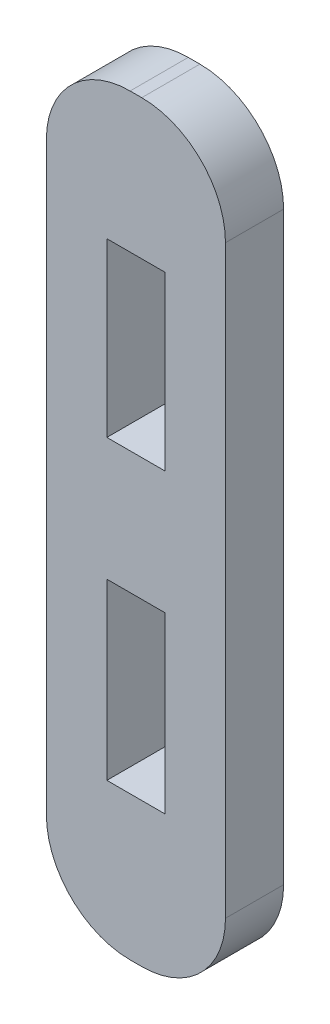
ISO-10303-21;
HEADER;
FILE_DESCRIPTION(('STEP AP214'),'2;1');
FILE_NAME('part.step','',(''),(''),'','','');
FILE_SCHEMA(('AUTOMOTIVE_DESIGN { 1 0 10303 214 1 1 1 1 }'));
ENDSEC;
DATA;
#1=APPLICATION_CONTEXT('core data for automotive mechanical design processes');
#2=APPLICATION_PROTOCOL_DEFINITION('international standard','automotive_design',2000,#1);
#3=PRODUCT_CONTEXT('',#1,'mechanical');
#4=PRODUCT('Part','Part','',(#3));
#5=PRODUCT_RELATED_PRODUCT_CATEGORY('part','',(#4));
#6=PRODUCT_DEFINITION_FORMATION('','',#4);
#7=PRODUCT_DEFINITION_CONTEXT('part definition',#1,'design');
#8=PRODUCT_DEFINITION('design','',#6,#7);
#9=PRODUCT_DEFINITION_SHAPE('','',#8);
#10=(LENGTH_UNIT() NAMED_UNIT(*) SI_UNIT(.MILLI.,.METRE.));
#11=(NAMED_UNIT(*) PLANE_ANGLE_UNIT() SI_UNIT($,.RADIAN.));
#12=(NAMED_UNIT(*) SI_UNIT($,.STERADIAN.) SOLID_ANGLE_UNIT());
#13=UNCERTAINTY_MEASURE_WITH_UNIT(LENGTH_MEASURE(1.E-05),#10,'distance_accuracy_value','');
#14=(GEOMETRIC_REPRESENTATION_CONTEXT(3) GLOBAL_UNCERTAINTY_ASSIGNED_CONTEXT((#13)) GLOBAL_UNIT_ASSIGNED_CONTEXT((#10,
#11,#12)) REPRESENTATION_CONTEXT('',''));
#15=CARTESIAN_POINT('',(0.,0.,0.));
#16=DIRECTION('',(0.,0.,1.));
#17=DIRECTION('',(1.,0.,0.));
#18=AXIS2_PLACEMENT_3D('',#15,#16,#17);
#19=CARTESIAN_POINT('',(0.,0.,1.5875));
#20=DIRECTION('',(1.,0.,0.));
#21=DIRECTION('',(0.,0.,-1.));
#22=AXIS2_PLACEMENT_3D('',#19,#20,#21);
#23=PLANE('',#22);
#24=DIRECTION('',(0.,-1.,0.));
#25=VECTOR('',#24,1.);
#26=CARTESIAN_POINT('',(0.,0.,0.));
#27=LINE('',#26,#25);
#28=CARTESIAN_POINT('',(0.,18.2591767851915,0.));
#29=VERTEX_POINT('',#28);
#30=CARTESIAN_POINT('',(0.,2.286,0.));
#31=VERTEX_POINT('',#30);
#32=EDGE_CURVE('E217',#29,#31,#27,.T.);
#33=ORIENTED_EDGE('',*,*,#32,.T.);
#34=DIRECTION('',(0.,0.,-1.));
#35=VECTOR('',#34,1.);
#36=CARTESIAN_POINT('',(0.,2.286,1.5875));
#37=LINE('',#36,#35);
#38=CARTESIAN_POINT('',(0.,2.286,1.5875));
#39=VERTEX_POINT('',#38);
#40=EDGE_CURVE('E259',#31,#39,#37,.F.);
#41=ORIENTED_EDGE('',*,*,#40,.T.);
#42=DIRECTION('',(0.,-1.,0.));
#43=VECTOR('',#42,1.);
#44=CARTESIAN_POINT('',(0.,0.,1.5875));
#45=LINE('',#44,#43);
#46=CARTESIAN_POINT('',(0.,18.2591767851915,1.5875));
#47=VERTEX_POINT('',#46);
#48=EDGE_CURVE('E223',#47,#39,#45,.T.);
#49=ORIENTED_EDGE('',*,*,#48,.F.);
#50=DIRECTION('',(0.,0.,-1.));
#51=VECTOR('',#50,1.);
#52=CARTESIAN_POINT('',(0.,18.2591767851915,1.5875));
#53=LINE('',#52,#51);
#54=EDGE_CURVE('E256',#47,#29,#53,.T.);
#55=ORIENTED_EDGE('',*,*,#54,.T.);
#56=EDGE_LOOP('',(#33,#41,#49,#55));
#57=FACE_BOUND('',#56,.T.);
#58=ADVANCED_FACE('F33',(#57),#23,.F.);
#59=CARTESIAN_POINT('',(0.,0.,1.5875));
#60=DIRECTION('',(0.,1.,0.));
#61=DIRECTION('',(0.,0.,1.));
#62=AXIS2_PLACEMENT_3D('',#59,#60,#61);
#63=PLANE('',#62);
#64=DIRECTION('',(1.,0.,0.));
#65=VECTOR('',#64,1.);
#66=CARTESIAN_POINT('',(0.,0.,1.5875));
#67=LINE('',#66,#65);
#68=CARTESIAN_POINT('',(2.286,0.,1.5875));
#69=VERTEX_POINT('',#68);
#70=CARTESIAN_POINT('',(2.60350000000089,0.,1.5875));
#71=VERTEX_POINT('',#70);
#72=EDGE_CURVE('E226',#69,#71,#67,.T.);
#73=ORIENTED_EDGE('',*,*,#72,.F.);
#74=DIRECTION('',(0.,0.,-1.));
#75=VECTOR('',#74,1.);
#76=CARTESIAN_POINT('',(2.286,0.,1.5875));
#77=LINE('',#76,#75);
#78=CARTESIAN_POINT('',(2.286,0.,0.));
#79=VERTEX_POINT('',#78);
#80=EDGE_CURVE('E245',#69,#79,#77,.T.);
#81=ORIENTED_EDGE('',*,*,#80,.T.);
#82=DIRECTION('',(1.,0.,0.));
#83=VECTOR('',#82,1.);
#84=CARTESIAN_POINT('',(0.,0.,0.));
#85=LINE('',#84,#83);
#86=CARTESIAN_POINT('',(2.60350000000089,0.,0.));
#87=VERTEX_POINT('',#86);
#88=EDGE_CURVE('E237',#79,#87,#85,.T.);
#89=ORIENTED_EDGE('',*,*,#88,.T.);
#90=DIRECTION('',(0.,0.,-1.));
#91=VECTOR('',#90,1.);
#92=CARTESIAN_POINT('',(2.60350000000089,0.,1.5875));
#93=LINE('',#92,#91);
#94=EDGE_CURVE('E234',#87,#71,#93,.F.);
#95=ORIENTED_EDGE('',*,*,#94,.T.);
#96=EDGE_LOOP('',(#73,#81,#89,#95));
#97=FACE_BOUND('',#96,.T.);
#98=ADVANCED_FACE('F301',(#97),#63,.F.);
#99=CARTESIAN_POINT('',(4.88950000000089,0.,1.5875));
#100=DIRECTION('',(-1.,0.,0.));
#101=DIRECTION('',(0.,-1.,0.));
#102=AXIS2_PLACEMENT_3D('',#99,#100,#101);
#103=PLANE('',#102);
#104=DIRECTION('',(0.,1.,0.));
#105=VECTOR('',#104,1.);
#106=CARTESIAN_POINT('',(4.88950000000089,0.,1.5875));
#107=LINE('',#106,#105);
#108=CARTESIAN_POINT('',(4.88950000000089,2.286,1.5875));
#109=VERTEX_POINT('',#108);
#110=CARTESIAN_POINT('',(4.88950000000092,18.2591767851915,1.5875));
#111=VERTEX_POINT('',#110);
#112=EDGE_CURVE('E230',#109,#111,#107,.T.);
#113=ORIENTED_EDGE('',*,*,#112,.F.);
#114=DIRECTION('',(0.,0.,-1.));
#115=VECTOR('',#114,1.);
#116=CARTESIAN_POINT('',(4.88950000000089,2.286,1.5875));
#117=LINE('',#116,#115);
#118=CARTESIAN_POINT('',(4.88950000000089,2.286,0.));
#119=VERTEX_POINT('',#118);
#120=EDGE_CURVE('E270',#109,#119,#117,.T.);
#121=ORIENTED_EDGE('',*,*,#120,.T.);
#122=DIRECTION('',(0.,1.,0.));
#123=VECTOR('',#122,1.);
#124=CARTESIAN_POINT('',(4.88950000000089,0.,0.));
#125=LINE('',#124,#123);
#126=CARTESIAN_POINT('',(4.88950000000092,18.2591767851915,0.));
#127=VERTEX_POINT('',#126);
#128=EDGE_CURVE('E240',#119,#127,#125,.T.);
#129=ORIENTED_EDGE('',*,*,#128,.T.);
#130=DIRECTION('',(0.,0.,-1.));
#131=VECTOR('',#130,1.);
#132=CARTESIAN_POINT('',(4.88950000000092,18.2591767851915,1.5875));
#133=LINE('',#132,#131);
#134=EDGE_CURVE('E268',#127,#111,#133,.F.);
#135=ORIENTED_EDGE('',*,*,#134,.T.);
#136=EDGE_LOOP('',(#113,#121,#129,#135));
#137=FACE_BOUND('',#136,.T.);
#138=ADVANCED_FACE('F276',(#137),#103,.F.);
#139=CARTESIAN_POINT('',(0.,20.5451767851915,1.5875));
#140=DIRECTION('',(0.,-1.,0.));
#141=DIRECTION('',(0.,0.,-1.));
#142=AXIS2_PLACEMENT_3D('',#139,#140,#141);
#143=PLANE('',#142);
#144=DIRECTION('',(-1.,0.,0.));
#145=VECTOR('',#144,1.);
#146=CARTESIAN_POINT('',(0.,20.5451767851915,1.5875));
#147=LINE('',#146,#145);
#148=CARTESIAN_POINT('',(2.60350000000092,20.5451767851915,1.5875));
#149=VERTEX_POINT('',#148);
#150=CARTESIAN_POINT('',(2.286,20.5451767851915,1.5875));
#151=VERTEX_POINT('',#150);
#152=EDGE_CURVE('E232',#149,#151,#147,.T.);
#153=ORIENTED_EDGE('',*,*,#152,.F.);
#154=DIRECTION('',(0.,0.,-1.));
#155=VECTOR('',#154,1.);
#156=CARTESIAN_POINT('',(2.60350000000092,20.5451767851915,1.5875));
#157=LINE('',#156,#155);
#158=CARTESIAN_POINT('',(2.60350000000092,20.5451767851915,0.));
#159=VERTEX_POINT('',#158);
#160=EDGE_CURVE('E11',#149,#159,#157,.T.);
#161=ORIENTED_EDGE('',*,*,#160,.T.);
#162=DIRECTION('',(-1.,0.,0.));
#163=VECTOR('',#162,1.);
#164=CARTESIAN_POINT('',(0.,20.5451767851915,0.));
#165=LINE('',#164,#163);
#166=CARTESIAN_POINT('',(2.286,20.5451767851915,0.));
#167=VERTEX_POINT('',#166);
#168=EDGE_CURVE('E227',#159,#167,#165,.T.);
#169=ORIENTED_EDGE('',*,*,#168,.T.);
#170=DIRECTION('',(0.,0.,-1.));
#171=VECTOR('',#170,1.);
#172=CARTESIAN_POINT('',(2.286,20.5451767851915,1.5875));
#173=LINE('',#172,#171);
#174=EDGE_CURVE('E41',#167,#151,#173,.F.);
#175=ORIENTED_EDGE('',*,*,#174,.T.);
#176=EDGE_LOOP('',(#153,#161,#169,#175));
#177=FACE_BOUND('',#176,.T.);
#178=ADVANCED_FACE('F287',(#177),#143,.F.);
#179=CARTESIAN_POINT('',(0.,0.,1.5875));
#180=DIRECTION('',(0.,0.,-1.));
#181=DIRECTION('',(-1.,0.,0.));
#182=AXIS2_PLACEMENT_3D('',#179,#180,#181);
#183=PLANE('',#182);
#184=DIRECTION('',(-1.,0.,0.));
#185=VECTOR('',#184,1.);
#186=CARTESIAN_POINT('',(3.23850000000115,12.0361767851871,1.5875));
#187=LINE('',#186,#185);
#188=CARTESIAN_POINT('',(3.23850000000115,12.0361767851871,1.5875));
#189=VERTEX_POINT('',#188);
#190=CARTESIAN_POINT('',(1.65100000000115,12.0361767851871,1.5875));
#191=VERTEX_POINT('',#190);
#192=EDGE_CURVE('E158',#189,#191,#187,.T.);
#193=ORIENTED_EDGE('',*,*,#192,.T.);
#194=DIRECTION('',(0.,1.,0.));
#195=VECTOR('',#194,1.);
#196=CARTESIAN_POINT('',(1.65100000000105,15.3513619189804,1.5875));
#197=LINE('',#196,#195);
#198=CARTESIAN_POINT('',(1.65100000000093,16.7351767851914,1.5875));
#199=VERTEX_POINT('',#198);
#200=EDGE_CURVE('E150',#191,#199,#197,.T.);
#201=ORIENTED_EDGE('',*,*,#200,.T.);
#202=DIRECTION('',(1.,0.,0.));
#203=VECTOR('',#202,1.);
#204=CARTESIAN_POINT('',(3.23850000000093,16.7351767851915,1.5875));
#205=LINE('',#204,#203);
#206=CARTESIAN_POINT('',(3.23850000000093,16.7351767851915,1.5875));
#207=VERTEX_POINT('',#206);
#208=EDGE_CURVE('E162',#199,#207,#205,.T.);
#209=ORIENTED_EDGE('',*,*,#208,.T.);
#210=DIRECTION('',(1.19447510828985E-13,-1.,0.));
#211=VECTOR('',#210,1.);
#212=CARTESIAN_POINT('',(3.23850000000105,15.6786362846699,1.5875));
#213=LINE('',#212,#211);
#214=EDGE_CURVE('E166',#207,#189,#213,.T.);
#215=ORIENTED_EDGE('',*,*,#214,.T.);
#216=EDGE_LOOP('',(#193,#201,#209,#215));
#217=FACE_BOUND('',#216,.T.);
#218=DIRECTION('',(-1.,0.,0.));
#219=VECTOR('',#218,1.);
#220=CARTESIAN_POINT('',(3.23850000000205,3.92778961237441,1.5875));
#221=LINE('',#220,#219);
#222=CARTESIAN_POINT('',(3.23850000000205,3.92778961237441,1.5875));
#223=VERTEX_POINT('',#222);
#224=CARTESIAN_POINT('',(1.65100000000205,3.92778961237427,1.5875));
#225=VERTEX_POINT('',#224);
#226=EDGE_CURVE('E201',#223,#225,#221,.T.);
#227=ORIENTED_EDGE('',*,*,#226,.T.);
#228=DIRECTION('',(0.,1.,0.));
#229=VECTOR('',#228,1.);
#230=CARTESIAN_POINT('',(1.65100000000196,4.86656469932414,1.5875));
#231=LINE('',#230,#229);
#232=CARTESIAN_POINT('',(1.65100000000115,8.68424253618715,1.5875));
#233=VERTEX_POINT('',#232);
#234=EDGE_CURVE('E191',#225,#233,#231,.T.);
#235=ORIENTED_EDGE('',*,*,#234,.T.);
#236=DIRECTION('',(1.,0.,0.));
#237=VECTOR('',#236,1.);
#238=CARTESIAN_POINT('',(3.23850000000115,8.68424253618715,1.5875));
#239=LINE('',#238,#237);
#240=CARTESIAN_POINT('',(3.23850000000115,8.68424253618715,1.5875));
#241=VERTEX_POINT('',#240);
#242=EDGE_CURVE('E194',#233,#241,#239,.T.);
#243=ORIENTED_EDGE('',*,*,#242,.T.);
#244=DIRECTION('',(2.99817312634776E-13,-1.,0.));
#245=VECTOR('',#244,1.);
#246=CARTESIAN_POINT('',(3.23850000000183,6.40747712261544,1.5875));
#247=LINE('',#246,#245);
#248=EDGE_CURVE('E198',#241,#223,#247,.T.);
#249=ORIENTED_EDGE('',*,*,#248,.T.);
#250=EDGE_LOOP('',(#227,#235,#243,#249));
#251=FACE_BOUND('',#250,.T.);
#252=ORIENTED_EDGE('',*,*,#48,.T.);
#253=CARTESIAN_POINT('',(2.286,2.286,1.5875));
#254=DIRECTION('',(0.,0.,-1.));
#255=DIRECTION('',(-1.,0.,0.));
#256=AXIS2_PLACEMENT_3D('',#253,#254,#255);
#257=CIRCLE('',#256,2.286);
#258=EDGE_CURVE('E266',#39,#69,#257,.F.);
#259=ORIENTED_EDGE('',*,*,#258,.T.);
#260=ORIENTED_EDGE('',*,*,#72,.T.);
#261=CARTESIAN_POINT('',(2.60350000000089,2.286,1.5875));
#262=DIRECTION('',(0.,0.,-1.));
#263=DIRECTION('',(-1.,0.,0.));
#264=AXIS2_PLACEMENT_3D('',#261,#262,#263);
#265=CIRCLE('',#264,2.286);
#266=EDGE_CURVE('E264',#71,#109,#265,.F.);
#267=ORIENTED_EDGE('',*,*,#266,.T.);
#268=ORIENTED_EDGE('',*,*,#112,.T.);
#269=CARTESIAN_POINT('',(2.60350000000092,18.2591767851915,1.5875));
#270=DIRECTION('',(0.,0.,-1.));
#271=DIRECTION('',(-1.,0.,0.));
#272=AXIS2_PLACEMENT_3D('',#269,#270,#271);
#273=CIRCLE('',#272,2.286);
#274=EDGE_CURVE('E54',#111,#149,#273,.F.);
#275=ORIENTED_EDGE('',*,*,#274,.T.);
#276=ORIENTED_EDGE('',*,*,#152,.T.);
#277=CARTESIAN_POINT('',(2.286,18.2591767851915,1.5875));
#278=DIRECTION('',(0.,0.,-1.));
#279=DIRECTION('',(-1.,0.,0.));
#280=AXIS2_PLACEMENT_3D('',#277,#278,#279);
#281=CIRCLE('',#280,2.286);
#282=EDGE_CURVE('E261',#151,#47,#281,.F.);
#283=ORIENTED_EDGE('',*,*,#282,.T.);
#284=EDGE_LOOP('',(#252,#259,#260,#267,#268,#275,#276,#283));
#285=FACE_BOUND('',#284,.T.);
#286=ADVANCED_FACE('F169',(#217,#251,#285),#183,.F.);
#287=CARTESIAN_POINT('',(0.,0.,0.));
#288=DIRECTION('',(0.,0.,-1.));
#289=DIRECTION('',(-1.,0.,0.));
#290=AXIS2_PLACEMENT_3D('',#287,#288,#289);
#291=PLANE('',#290);
#292=DIRECTION('',(0.,1.,0.));
#293=VECTOR('',#292,1.);
#294=CARTESIAN_POINT('',(1.65100000000115,14.195176785187,0.));
#295=LINE('',#294,#293);
#296=CARTESIAN_POINT('',(1.65100000000115,12.0361767851871,0.));
#297=VERTEX_POINT('',#296);
#298=CARTESIAN_POINT('',(1.65100000000093,16.7351767851914,0.));
#299=VERTEX_POINT('',#298);
#300=EDGE_CURVE('E153',#297,#299,#295,.T.);
#301=ORIENTED_EDGE('',*,*,#300,.F.);
#302=DIRECTION('',(-1.,0.,0.));
#303=VECTOR('',#302,1.);
#304=CARTESIAN_POINT('',(3.23850000000115,12.0361767851871,0.));
#305=LINE('',#304,#303);
#306=CARTESIAN_POINT('',(3.23850000000115,12.0361767851871,0.));
#307=VERTEX_POINT('',#306);
#308=EDGE_CURVE('E173',#307,#297,#305,.T.);
#309=ORIENTED_EDGE('',*,*,#308,.F.);
#310=DIRECTION('',(0.,-1.,0.));
#311=VECTOR('',#310,1.);
#312=CARTESIAN_POINT('',(3.23850000000115,14.1951767851871,0.));
#313=LINE('',#312,#311);
#314=CARTESIAN_POINT('',(3.23850000000093,16.7351767851915,0.));
#315=VERTEX_POINT('',#314);
#316=EDGE_CURVE('E180',#315,#307,#313,.T.);
#317=ORIENTED_EDGE('',*,*,#316,.F.);
#318=DIRECTION('',(1.,0.,0.));
#319=VECTOR('',#318,1.);
#320=CARTESIAN_POINT('',(3.23850000000093,16.7351767851915,0.));
#321=LINE('',#320,#319);
#322=EDGE_CURVE('E178',#299,#315,#321,.T.);
#323=ORIENTED_EDGE('',*,*,#322,.F.);
#324=EDGE_LOOP('',(#301,#309,#317,#323));
#325=FACE_BOUND('',#324,.T.);
#326=DIRECTION('',(0.,1.,0.));
#327=VECTOR('',#326,1.);
#328=CARTESIAN_POINT('',(1.65100000000205,3.92778961237427,0.));
#329=LINE('',#328,#327);
#330=CARTESIAN_POINT('',(1.65100000000205,3.92778961237427,0.));
#331=VERTEX_POINT('',#330);
#332=CARTESIAN_POINT('',(1.65100000000115,8.68424253618715,0.));
#333=VERTEX_POINT('',#332);
#334=EDGE_CURVE('E195',#331,#333,#329,.T.);
#335=ORIENTED_EDGE('',*,*,#334,.F.);
#336=DIRECTION('',(-1.,0.,0.));
#337=VECTOR('',#336,1.);
#338=CARTESIAN_POINT('',(3.23850000000205,3.92778961237441,0.));
#339=LINE('',#338,#337);
#340=CARTESIAN_POINT('',(3.23850000000205,3.92778961237441,0.));
#341=VERTEX_POINT('',#340);
#342=EDGE_CURVE('E210',#341,#331,#339,.T.);
#343=ORIENTED_EDGE('',*,*,#342,.F.);
#344=DIRECTION('',(0.,-1.,0.));
#345=VECTOR('',#344,1.);
#346=CARTESIAN_POINT('',(3.23850000000205,3.92778961237441,0.));
#347=LINE('',#346,#345);
#348=CARTESIAN_POINT('',(3.23850000000115,8.68424253618715,0.));
#349=VERTEX_POINT('',#348);
#350=EDGE_CURVE('E207',#349,#341,#347,.T.);
#351=ORIENTED_EDGE('',*,*,#350,.F.);
#352=DIRECTION('',(1.,0.,0.));
#353=VECTOR('',#352,1.);
#354=CARTESIAN_POINT('',(3.23850000000115,8.68424253618715,0.));
#355=LINE('',#354,#353);
#356=EDGE_CURVE('E187',#333,#349,#355,.T.);
#357=ORIENTED_EDGE('',*,*,#356,.F.);
#358=EDGE_LOOP('',(#335,#343,#351,#357));
#359=FACE_BOUND('',#358,.T.);
#360=ORIENTED_EDGE('',*,*,#88,.F.);
#361=CARTESIAN_POINT('',(2.286,2.286,0.));
#362=DIRECTION('',(0.,0.,-1.));
#363=DIRECTION('',(-1.,0.,0.));
#364=AXIS2_PLACEMENT_3D('',#361,#362,#363);
#365=CIRCLE('',#364,2.286);
#366=EDGE_CURVE('E254',#79,#31,#365,.T.);
#367=ORIENTED_EDGE('',*,*,#366,.T.);
#368=ORIENTED_EDGE('',*,*,#32,.F.);
#369=CARTESIAN_POINT('',(2.286,18.2591767851915,0.));
#370=DIRECTION('',(0.,0.,-1.));
#371=DIRECTION('',(-1.,0.,0.));
#372=AXIS2_PLACEMENT_3D('',#369,#370,#371);
#373=CIRCLE('',#372,2.286);
#374=EDGE_CURVE('E248',#29,#167,#373,.T.);
#375=ORIENTED_EDGE('',*,*,#374,.T.);
#376=ORIENTED_EDGE('',*,*,#168,.F.);
#377=CARTESIAN_POINT('',(2.60350000000092,18.2591767851915,0.));
#378=DIRECTION('',(0.,0.,-1.));
#379=DIRECTION('',(-1.,0.,0.));
#380=AXIS2_PLACEMENT_3D('',#377,#378,#379);
#381=CIRCLE('',#380,2.286);
#382=EDGE_CURVE('E250',#159,#127,#381,.T.);
#383=ORIENTED_EDGE('',*,*,#382,.T.);
#384=ORIENTED_EDGE('',*,*,#128,.F.);
#385=CARTESIAN_POINT('',(2.60350000000089,2.286,0.));
#386=DIRECTION('',(0.,0.,-1.));
#387=DIRECTION('',(-1.,0.,0.));
#388=AXIS2_PLACEMENT_3D('',#385,#386,#387);
#389=CIRCLE('',#388,2.286);
#390=EDGE_CURVE('E252',#119,#87,#389,.T.);
#391=ORIENTED_EDGE('',*,*,#390,.T.);
#392=EDGE_LOOP('',(#360,#367,#368,#375,#376,#383,#384,#391));
#393=FACE_BOUND('',#392,.T.);
#394=ADVANCED_FACE('F282',(#325,#359,#393),#291,.T.);
#395=CARTESIAN_POINT('',(1.65100000000205,3.92778961237427,1.5875));
#396=DIRECTION('',(-1.,0.,0.));
#397=DIRECTION('',(0.,-1.,0.));
#398=AXIS2_PLACEMENT_3D('',#395,#396,#397);
#399=PLANE('',#398);
#400=ORIENTED_EDGE('',*,*,#334,.T.);
#401=DIRECTION('',(0.,0.,-1.));
#402=VECTOR('',#401,1.);
#403=CARTESIAN_POINT('',(1.65100000000115,8.68424253618715,1.5875));
#404=LINE('',#403,#402);
#405=EDGE_CURVE('E204',#233,#333,#404,.T.);
#406=ORIENTED_EDGE('',*,*,#405,.F.);
#407=ORIENTED_EDGE('',*,*,#234,.F.);
#408=DIRECTION('',(0.,0.,-1.));
#409=VECTOR('',#408,1.);
#410=CARTESIAN_POINT('',(1.65100000000205,3.92778961237427,1.5875));
#411=LINE('',#410,#409);
#412=EDGE_CURVE('E215',#225,#331,#411,.T.);
#413=ORIENTED_EDGE('',*,*,#412,.T.);
#414=EDGE_LOOP('',(#400,#406,#407,#413));
#415=FACE_BOUND('',#414,.T.);
#416=ADVANCED_FACE('F324',(#415),#399,.F.);
#417=CARTESIAN_POINT('',(3.23850000000205,3.92778961237441,1.5875));
#418=DIRECTION('',(0.,-1.,0.));
#419=DIRECTION('',(1.,0.,0.));
#420=AXIS2_PLACEMENT_3D('',#417,#418,#419);
#421=PLANE('',#420);
#422=ORIENTED_EDGE('',*,*,#342,.T.);
#423=ORIENTED_EDGE('',*,*,#412,.F.);
#424=ORIENTED_EDGE('',*,*,#226,.F.);
#425=DIRECTION('',(0.,0.,-1.));
#426=VECTOR('',#425,1.);
#427=CARTESIAN_POINT('',(3.23850000000205,3.92778961237441,1.5875));
#428=LINE('',#427,#426);
#429=EDGE_CURVE('E218',#223,#341,#428,.T.);
#430=ORIENTED_EDGE('',*,*,#429,.T.);
#431=EDGE_LOOP('',(#422,#423,#424,#430));
#432=FACE_BOUND('',#431,.T.);
#433=ADVANCED_FACE('F335',(#432),#421,.F.);
#434=CARTESIAN_POINT('',(3.23850000000205,3.92778961237441,1.5875));
#435=DIRECTION('',(1.,0.,0.));
#436=DIRECTION('',(0.,1.,0.));
#437=AXIS2_PLACEMENT_3D('',#434,#435,#436);
#438=PLANE('',#437);
#439=ORIENTED_EDGE('',*,*,#350,.T.);
#440=ORIENTED_EDGE('',*,*,#429,.F.);
#441=ORIENTED_EDGE('',*,*,#248,.F.);
#442=DIRECTION('',(0.,0.,-1.));
#443=VECTOR('',#442,1.);
#444=CARTESIAN_POINT('',(3.23850000000115,8.68424253618715,1.5875));
#445=LINE('',#444,#443);
#446=EDGE_CURVE('E220',#241,#349,#445,.T.);
#447=ORIENTED_EDGE('',*,*,#446,.T.);
#448=EDGE_LOOP('',(#439,#440,#441,#447));
#449=FACE_BOUND('',#448,.T.);
#450=ADVANCED_FACE('F331',(#449),#438,.F.);
#451=CARTESIAN_POINT('',(3.23850000000115,8.68424253618715,1.5875));
#452=DIRECTION('',(0.,1.,0.));
#453=DIRECTION('',(0.,0.,1.));
#454=AXIS2_PLACEMENT_3D('',#451,#452,#453);
#455=PLANE('',#454);
#456=ORIENTED_EDGE('',*,*,#356,.T.);
#457=ORIENTED_EDGE('',*,*,#446,.F.);
#458=ORIENTED_EDGE('',*,*,#242,.F.);
#459=ORIENTED_EDGE('',*,*,#405,.T.);
#460=EDGE_LOOP('',(#456,#457,#458,#459));
#461=FACE_BOUND('',#460,.T.);
#462=ADVANCED_FACE('F328',(#461),#455,.F.);
#463=CARTESIAN_POINT('',(1.65100000000115,14.195176785187,1.5875));
#464=DIRECTION('',(-1.,0.,0.));
#465=DIRECTION('',(0.,-1.,0.));
#466=AXIS2_PLACEMENT_3D('',#463,#464,#465);
#467=PLANE('',#466);
#468=ORIENTED_EDGE('',*,*,#300,.T.);
#469=DIRECTION('',(0.,0.,-1.));
#470=VECTOR('',#469,1.);
#471=CARTESIAN_POINT('',(1.65100000000093,16.7351767851914,1.5875));
#472=LINE('',#471,#470);
#473=EDGE_CURVE('E146',#199,#299,#472,.T.);
#474=ORIENTED_EDGE('',*,*,#473,.F.);
#475=ORIENTED_EDGE('',*,*,#200,.F.);
#476=DIRECTION('',(0.,0.,-1.));
#477=VECTOR('',#476,1.);
#478=CARTESIAN_POINT('',(1.65100000000115,12.0361767851871,1.5875));
#479=LINE('',#478,#477);
#480=EDGE_CURVE('E185',#191,#297,#479,.T.);
#481=ORIENTED_EDGE('',*,*,#480,.T.);
#482=EDGE_LOOP('',(#468,#474,#475,#481));
#483=FACE_BOUND('',#482,.T.);
#484=ADVANCED_FACE('F148',(#483),#467,.F.);
#485=CARTESIAN_POINT('',(3.23850000000115,12.0361767851871,1.5875));
#486=DIRECTION('',(0.,-1.,0.));
#487=DIRECTION('',(0.,0.,-1.));
#488=AXIS2_PLACEMENT_3D('',#485,#486,#487);
#489=PLANE('',#488);
#490=ORIENTED_EDGE('',*,*,#308,.T.);
#491=ORIENTED_EDGE('',*,*,#480,.F.);
#492=ORIENTED_EDGE('',*,*,#192,.F.);
#493=DIRECTION('',(0.,0.,-1.));
#494=VECTOR('',#493,1.);
#495=CARTESIAN_POINT('',(3.23850000000115,12.0361767851871,1.5875));
#496=LINE('',#495,#494);
#497=EDGE_CURVE('E188',#189,#307,#496,.T.);
#498=ORIENTED_EDGE('',*,*,#497,.T.);
#499=EDGE_LOOP('',(#490,#491,#492,#498));
#500=FACE_BOUND('',#499,.T.);
#501=ADVANCED_FACE('F348',(#500),#489,.F.);
#502=CARTESIAN_POINT('',(3.23850000000115,14.1951767851871,1.5875));
#503=DIRECTION('',(1.,0.,0.));
#504=DIRECTION('',(0.,1.,0.));
#505=AXIS2_PLACEMENT_3D('',#502,#503,#504);
#506=PLANE('',#505);
#507=ORIENTED_EDGE('',*,*,#316,.T.);
#508=ORIENTED_EDGE('',*,*,#497,.F.);
#509=ORIENTED_EDGE('',*,*,#214,.F.);
#510=DIRECTION('',(0.,0.,-1.));
#511=VECTOR('',#510,1.);
#512=CARTESIAN_POINT('',(3.23850000000093,16.7351767851915,1.5875));
#513=LINE('',#512,#511);
#514=EDGE_CURVE('E157',#207,#315,#513,.T.);
#515=ORIENTED_EDGE('',*,*,#514,.T.);
#516=EDGE_LOOP('',(#507,#508,#509,#515));
#517=FACE_BOUND('',#516,.T.);
#518=ADVANCED_FACE('F345',(#517),#506,.F.);
#519=CARTESIAN_POINT('',(3.23850000000093,16.7351767851915,1.5875));
#520=DIRECTION('',(0.,1.,0.));
#521=DIRECTION('',(-1.,0.,0.));
#522=AXIS2_PLACEMENT_3D('',#519,#520,#521);
#523=PLANE('',#522);
#524=ORIENTED_EDGE('',*,*,#322,.T.);
#525=ORIENTED_EDGE('',*,*,#514,.F.);
#526=ORIENTED_EDGE('',*,*,#208,.F.);
#527=ORIENTED_EDGE('',*,*,#473,.T.);
#528=EDGE_LOOP('',(#524,#525,#526,#527));
#529=FACE_BOUND('',#528,.T.);
#530=ADVANCED_FACE('F163',(#529),#523,.F.);
#531=CARTESIAN_POINT('',(2.286,2.286,1.5875));
#532=DIRECTION('',(0.,0.,-1.));
#533=DIRECTION('',(-1.,0.,0.));
#534=AXIS2_PLACEMENT_3D('',#531,#532,#533);
#535=CYLINDRICAL_SURFACE('',#534,2.286);
#536=ORIENTED_EDGE('',*,*,#258,.F.);
#537=ORIENTED_EDGE('',*,*,#40,.F.);
#538=ORIENTED_EDGE('',*,*,#366,.F.);
#539=ORIENTED_EDGE('',*,*,#80,.F.);
#540=EDGE_LOOP('',(#536,#537,#538,#539));
#541=FACE_BOUND('',#540,.T.);
#542=ADVANCED_FACE('F298',(#541),#535,.T.);
#543=CARTESIAN_POINT('',(2.60350000000089,2.286,1.5875));
#544=DIRECTION('',(0.,0.,-1.));
#545=DIRECTION('',(-1.,0.,0.));
#546=AXIS2_PLACEMENT_3D('',#543,#544,#545);
#547=CYLINDRICAL_SURFACE('',#546,2.286);
#548=ORIENTED_EDGE('',*,*,#266,.F.);
#549=ORIENTED_EDGE('',*,*,#94,.F.);
#550=ORIENTED_EDGE('',*,*,#390,.F.);
#551=ORIENTED_EDGE('',*,*,#120,.F.);
#552=EDGE_LOOP('',(#548,#549,#550,#551));
#553=FACE_BOUND('',#552,.T.);
#554=ADVANCED_FACE('F303',(#553),#547,.T.);
#555=CARTESIAN_POINT('',(2.60350000000092,18.2591767851915,1.5875));
#556=DIRECTION('',(0.,0.,-1.));
#557=DIRECTION('',(-1.,0.,0.));
#558=AXIS2_PLACEMENT_3D('',#555,#556,#557);
#559=CYLINDRICAL_SURFACE('',#558,2.286);
#560=ORIENTED_EDGE('',*,*,#274,.F.);
#561=ORIENTED_EDGE('',*,*,#134,.F.);
#562=ORIENTED_EDGE('',*,*,#382,.F.);
#563=ORIENTED_EDGE('',*,*,#160,.F.);
#564=EDGE_LOOP('',(#560,#561,#562,#563));
#565=FACE_BOUND('',#564,.T.);
#566=ADVANCED_FACE('F286',(#565),#559,.T.);
#567=CARTESIAN_POINT('',(2.286,18.2591767851915,1.5875));
#568=DIRECTION('',(0.,0.,-1.));
#569=DIRECTION('',(-1.,0.,0.));
#570=AXIS2_PLACEMENT_3D('',#567,#568,#569);
#571=CYLINDRICAL_SURFACE('',#570,2.286);
#572=ORIENTED_EDGE('',*,*,#282,.F.);
#573=ORIENTED_EDGE('',*,*,#174,.F.);
#574=ORIENTED_EDGE('',*,*,#374,.F.);
#575=ORIENTED_EDGE('',*,*,#54,.F.);
#576=EDGE_LOOP('',(#572,#573,#574,#575));
#577=FACE_BOUND('',#576,.T.);
#578=ADVANCED_FACE('F35',(#577),#571,.T.);
#579=CLOSED_SHELL('',(#58,#98,#138,#178,#286,#394,#416,#433,#450,#462,#484,#501,#518,#530,#542,
#554,#566,#578));
#580=MANIFOLD_SOLID_BREP('B2',#579);
#581=ADVANCED_BREP_SHAPE_REPRESENTATION('',(#18,#580),#14);
#582=SHAPE_DEFINITION_REPRESENTATION(#9,#581);
ENDSEC;
END-ISO-10303-21;
